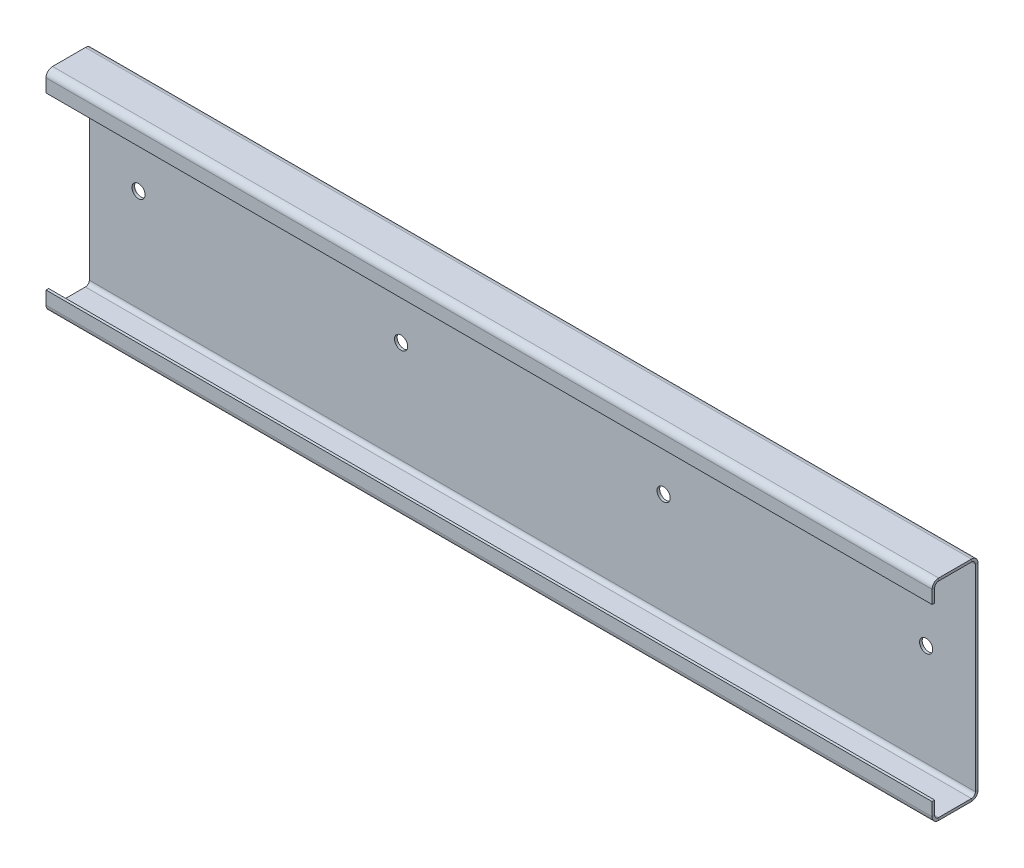
ISO-10303-21;
HEADER;
FILE_DESCRIPTION(('STEP AP214'),'2;1');
FILE_NAME('part.step','',(''),(''),'','','');
FILE_SCHEMA(('AUTOMOTIVE_DESIGN { 1 0 10303 214 1 1 1 1 }'));
ENDSEC;
DATA;
#1=APPLICATION_CONTEXT('core data for automotive mechanical design processes');
#2=APPLICATION_PROTOCOL_DEFINITION('international standard','automotive_design',2000,#1);
#3=PRODUCT_CONTEXT('',#1,'mechanical');
#4=PRODUCT('Part','Part','',(#3));
#5=PRODUCT_RELATED_PRODUCT_CATEGORY('part','',(#4));
#6=PRODUCT_DEFINITION_FORMATION('','',#4);
#7=PRODUCT_DEFINITION_CONTEXT('part definition',#1,'design');
#8=PRODUCT_DEFINITION('design','',#6,#7);
#9=PRODUCT_DEFINITION_SHAPE('','',#8);
#10=(LENGTH_UNIT() NAMED_UNIT(*) SI_UNIT(.MILLI.,.METRE.));
#11=(NAMED_UNIT(*) PLANE_ANGLE_UNIT() SI_UNIT($,.RADIAN.));
#12=(NAMED_UNIT(*) SI_UNIT($,.STERADIAN.) SOLID_ANGLE_UNIT());
#13=UNCERTAINTY_MEASURE_WITH_UNIT(LENGTH_MEASURE(1.E-05),#10,'distance_accuracy_value','');
#14=(GEOMETRIC_REPRESENTATION_CONTEXT(3) GLOBAL_UNCERTAINTY_ASSIGNED_CONTEXT((#13)) GLOBAL_UNIT_ASSIGNED_CONTEXT((#10,
#11,#12)) REPRESENTATION_CONTEXT('',''));
#15=CARTESIAN_POINT('',(0.,0.,0.));
#16=DIRECTION('',(0.,0.,1.));
#17=DIRECTION('',(1.,0.,0.));
#18=AXIS2_PLACEMENT_3D('',#15,#16,#17);
#19=CARTESIAN_POINT('',(-300.,2.48999999999999,8.00000000000001));
#20=DIRECTION('',(0.,0.,-1.));
#21=DIRECTION('',(-1.,0.,0.));
#22=AXIS2_PLACEMENT_3D('',#19,#20,#21);
#23=CYLINDRICAL_SURFACE('',#22,4.99999999999999);
#24=CARTESIAN_POINT('',(-300.,2.48999999999999,-2.));
#25=DIRECTION('',(0.,0.,-1.));
#26=DIRECTION('',(-1.,0.,0.));
#27=AXIS2_PLACEMENT_3D('',#24,#25,#26);
#28=CIRCLE('',#27,4.99999999999999);
#29=CARTESIAN_POINT('',(-305.,2.48999999999999,-2.));
#30=VERTEX_POINT('',#29);
#31=EDGE_CURVE('E139',#30,#30,#28,.T.);
#32=ORIENTED_EDGE('',*,*,#31,.T.);
#33=EDGE_LOOP('',(#32));
#34=FACE_BOUND('',#33,.T.);
#35=CARTESIAN_POINT('',(-300.,2.48999999999999,0.));
#36=DIRECTION('',(0.,0.,-1.));
#37=DIRECTION('',(-1.,0.,0.));
#38=AXIS2_PLACEMENT_3D('',#35,#36,#37);
#39=CIRCLE('',#38,4.99999999999999);
#40=CARTESIAN_POINT('',(-305.,2.48999999999999,0.));
#41=VERTEX_POINT('',#40);
#42=EDGE_CURVE('E15',#41,#41,#39,.T.);
#43=ORIENTED_EDGE('',*,*,#42,.F.);
#44=EDGE_LOOP('',(#43));
#45=FACE_BOUND('',#44,.T.);
#46=ADVANCED_FACE('F132',(#34,#45),#23,.F.);
#47=CARTESIAN_POINT('',(-100.,2.48999999999999,8.00000000000001));
#48=DIRECTION('',(0.,0.,-1.));
#49=DIRECTION('',(-1.,0.,0.));
#50=AXIS2_PLACEMENT_3D('',#47,#48,#49);
#51=CYLINDRICAL_SURFACE('',#50,4.99999999999999);
#52=CARTESIAN_POINT('',(-100.,2.48999999999999,-2.));
#53=DIRECTION('',(0.,0.,-1.));
#54=DIRECTION('',(-1.,0.,0.));
#55=AXIS2_PLACEMENT_3D('',#52,#53,#54);
#56=CIRCLE('',#55,4.99999999999999);
#57=CARTESIAN_POINT('',(-105.,2.48999999999999,-2.));
#58=VERTEX_POINT('',#57);
#59=EDGE_CURVE('E479',#58,#58,#56,.T.);
#60=ORIENTED_EDGE('',*,*,#59,.T.);
#61=EDGE_LOOP('',(#60));
#62=FACE_BOUND('',#61,.T.);
#63=CARTESIAN_POINT('',(-100.,2.48999999999999,0.));
#64=DIRECTION('',(0.,0.,-1.));
#65=DIRECTION('',(-1.,0.,0.));
#66=AXIS2_PLACEMENT_3D('',#63,#64,#65);
#67=CIRCLE('',#66,4.99999999999999);
#68=CARTESIAN_POINT('',(-105.,2.48999999999999,0.));
#69=VERTEX_POINT('',#68);
#70=EDGE_CURVE('E489',#69,#69,#67,.T.);
#71=ORIENTED_EDGE('',*,*,#70,.F.);
#72=EDGE_LOOP('',(#71));
#73=FACE_BOUND('',#72,.T.);
#74=ADVANCED_FACE('F515',(#62,#73),#51,.F.);
#75=CARTESIAN_POINT('',(337.5,80.,0.));
#76=DIRECTION('',(-1.,0.,0.));
#77=DIRECTION('',(0.,0.,1.));
#78=AXIS2_PLACEMENT_3D('',#75,#76,#77);
#79=PLANE('',#78);
#80=DIRECTION('',(0.,1.,0.));
#81=VECTOR('',#80,1.);
#82=CARTESIAN_POINT('',(337.5,78.0000000000001,28.));
#83=LINE('',#82,#81);
#84=CARTESIAN_POINT('',(337.5,78.0000000000001,28.));
#85=VERTEX_POINT('',#84);
#86=CARTESIAN_POINT('',(337.5,80.0000000000001,28.));
#87=VERTEX_POINT('',#86);
#88=EDGE_CURVE('E331',#85,#87,#83,.T.);
#89=ORIENTED_EDGE('',*,*,#88,.F.);
#90=DIRECTION('',(0.,0.,1.));
#91=VECTOR('',#90,1.);
#92=CARTESIAN_POINT('',(337.5,78.,0.));
#93=LINE('',#92,#91);
#94=CARTESIAN_POINT('',(337.5,78.0000000000001,3.00000000000011));
#95=VERTEX_POINT('',#94);
#96=EDGE_CURVE('E437',#85,#95,#93,.F.);
#97=ORIENTED_EDGE('',*,*,#96,.T.);
#98=DIRECTION('',(0.,-1.,0.));
#99=VECTOR('',#98,1.);
#100=CARTESIAN_POINT('',(337.5,80.0000000000001,2.99999999999989));
#101=LINE('',#100,#99);
#102=CARTESIAN_POINT('',(337.5,80.0000000000001,2.99999999999989));
#103=VERTEX_POINT('',#102);
#104=EDGE_CURVE('E427',#95,#103,#101,.F.);
#105=ORIENTED_EDGE('',*,*,#104,.T.);
#106=DIRECTION('',(0.,0.,-1.));
#107=VECTOR('',#106,1.);
#108=CARTESIAN_POINT('',(337.5,80.,-2.22044604925031E-13));
#109=LINE('',#108,#107);
#110=EDGE_CURVE('E433',#87,#103,#109,.T.);
#111=ORIENTED_EDGE('',*,*,#110,.F.);
#112=EDGE_LOOP('',(#89,#97,#105,#111));
#113=FACE_BOUND('',#112,.T.);
#114=ADVANCED_FACE('F519',(#113),#79,.F.);
#115=CARTESIAN_POINT('',(-337.5,80.0000000000001,32.9999999999999));
#116=DIRECTION('',(1.,0.,0.));
#117=DIRECTION('',(0.,0.,-1.));
#118=AXIS2_PLACEMENT_3D('',#115,#116,#117);
#119=PLANE('',#118);
#120=DIRECTION('',(0.,1.,0.));
#121=VECTOR('',#120,1.);
#122=CARTESIAN_POINT('',(-337.5,78.0000000000001,28.));
#123=LINE('',#122,#121);
#124=CARTESIAN_POINT('',(-337.5,78.0000000000001,28.));
#125=VERTEX_POINT('',#124);
#126=CARTESIAN_POINT('',(-337.5,80.0000000000001,28.));
#127=VERTEX_POINT('',#126);
#128=EDGE_CURVE('E321',#125,#127,#123,.T.);
#129=ORIENTED_EDGE('',*,*,#128,.T.);
#130=DIRECTION('',(0.,0.,1.));
#131=VECTOR('',#130,1.);
#132=CARTESIAN_POINT('',(-337.5,80.,-2.22044604925031E-13));
#133=LINE('',#132,#131);
#134=CARTESIAN_POINT('',(-337.5,80.0000000000001,2.99999999999989));
#135=VERTEX_POINT('',#134);
#136=EDGE_CURVE('E430',#135,#127,#133,.T.);
#137=ORIENTED_EDGE('',*,*,#136,.F.);
#138=DIRECTION('',(0.,-1.,0.));
#139=VECTOR('',#138,1.);
#140=CARTESIAN_POINT('',(-337.5,78.0000000000001,2.99999999999989));
#141=LINE('',#140,#139);
#142=CARTESIAN_POINT('',(-337.5,78.0000000000001,2.99999999999989));
#143=VERTEX_POINT('',#142);
#144=EDGE_CURVE('E442',#143,#135,#141,.F.);
#145=ORIENTED_EDGE('',*,*,#144,.F.);
#146=DIRECTION('',(0.,0.,-1.));
#147=VECTOR('',#146,1.);
#148=CARTESIAN_POINT('',(-337.5,78.0000000000001,32.9999999999999));
#149=LINE('',#148,#147);
#150=EDGE_CURVE('E435',#143,#125,#149,.F.);
#151=ORIENTED_EDGE('',*,*,#150,.T.);
#152=EDGE_LOOP('',(#129,#137,#145,#151));
#153=FACE_BOUND('',#152,.T.);
#154=ADVANCED_FACE('F524',(#153),#119,.F.);
#155=CARTESIAN_POINT('',(0.,80.,-2.22044604925031E-13));
#156=DIRECTION('',(0.,-1.,0.));
#157=DIRECTION('',(0.,0.,-1.));
#158=AXIS2_PLACEMENT_3D('',#155,#156,#157);
#159=PLANE('',#158);
#160=DIRECTION('',(-1.,0.,0.));
#161=VECTOR('',#160,1.);
#162=CARTESIAN_POINT('',(-337.5,80.0000000000001,28.));
#163=LINE('',#162,#161);
#164=EDGE_CURVE('E315',#127,#87,#163,.F.);
#165=ORIENTED_EDGE('',*,*,#164,.T.);
#166=ORIENTED_EDGE('',*,*,#110,.T.);
#167=DIRECTION('',(-1.,0.,0.));
#168=VECTOR('',#167,1.);
#169=CARTESIAN_POINT('',(337.5,80.0000000000001,2.99999999999989));
#170=LINE('',#169,#168);
#171=EDGE_CURVE('E439',#135,#103,#170,.F.);
#172=ORIENTED_EDGE('',*,*,#171,.F.);
#173=ORIENTED_EDGE('',*,*,#136,.T.);
#174=EDGE_LOOP('',(#165,#166,#172,#173));
#175=FACE_BOUND('',#174,.T.);
#176=ADVANCED_FACE('F684',(#175),#159,.F.);
#177=CARTESIAN_POINT('',(0.,78.,-2.22044604925031E-13));
#178=DIRECTION('',(0.,-1.,0.));
#179=DIRECTION('',(0.,0.,-1.));
#180=AXIS2_PLACEMENT_3D('',#177,#178,#179);
#181=PLANE('',#180);
#182=ORIENTED_EDGE('',*,*,#96,.F.);
#183=DIRECTION('',(-1.,0.,0.));
#184=VECTOR('',#183,1.);
#185=CARTESIAN_POINT('',(-337.5,78.0000000000001,28.));
#186=LINE('',#185,#184);
#187=EDGE_CURVE('E146',#125,#85,#186,.F.);
#188=ORIENTED_EDGE('',*,*,#187,.F.);
#189=ORIENTED_EDGE('',*,*,#150,.F.);
#190=DIRECTION('',(-1.,0.,0.));
#191=VECTOR('',#190,1.);
#192=CARTESIAN_POINT('',(337.5,78.0000000000001,2.99999999999989));
#193=LINE('',#192,#191);
#194=EDGE_CURVE('E445',#95,#143,#193,.T.);
#195=ORIENTED_EDGE('',*,*,#194,.F.);
#196=EDGE_LOOP('',(#182,#188,#189,#195));
#197=FACE_BOUND('',#196,.T.);
#198=ADVANCED_FACE('F560',(#197),#181,.T.);
#199=CARTESIAN_POINT('',(-337.5,-80.,0.));
#200=DIRECTION('',(1.,0.,0.));
#201=DIRECTION('',(0.,0.,-1.));
#202=AXIS2_PLACEMENT_3D('',#199,#200,#201);
#203=PLANE('',#202);
#204=DIRECTION('',(0.,-1.,0.));
#205=VECTOR('',#204,1.);
#206=CARTESIAN_POINT('',(-337.5,-78.0000000000001,28.));
#207=LINE('',#206,#205);
#208=CARTESIAN_POINT('',(-337.5,-78.0000000000001,28.));
#209=VERTEX_POINT('',#208);
#210=CARTESIAN_POINT('',(-337.5,-80.0000000000001,28.));
#211=VERTEX_POINT('',#210);
#212=EDGE_CURVE('E382',#209,#211,#207,.T.);
#213=ORIENTED_EDGE('',*,*,#212,.F.);
#214=DIRECTION('',(0.,0.,1.));
#215=VECTOR('',#214,1.);
#216=CARTESIAN_POINT('',(-337.5,-78.,0.));
#217=LINE('',#216,#215);
#218=CARTESIAN_POINT('',(-337.5,-78.,2.99999999999989));
#219=VERTEX_POINT('',#218);
#220=EDGE_CURVE('E395',#209,#219,#217,.F.);
#221=ORIENTED_EDGE('',*,*,#220,.T.);
#222=DIRECTION('',(0.,1.,0.));
#223=VECTOR('',#222,1.);
#224=CARTESIAN_POINT('',(-337.5,-80.,2.99999999999989));
#225=LINE('',#224,#223);
#226=CARTESIAN_POINT('',(-337.5,-80.,2.99999999999989));
#227=VERTEX_POINT('',#226);
#228=EDGE_CURVE('E385',#219,#227,#225,.F.);
#229=ORIENTED_EDGE('',*,*,#228,.T.);
#230=DIRECTION('',(0.,0.,-1.));
#231=VECTOR('',#230,1.);
#232=CARTESIAN_POINT('',(-337.5,-80.,-2.22044604925031E-13));
#233=LINE('',#232,#231);
#234=EDGE_CURVE('E391',#211,#227,#233,.T.);
#235=ORIENTED_EDGE('',*,*,#234,.F.);
#236=EDGE_LOOP('',(#213,#221,#229,#235));
#237=FACE_BOUND('',#236,.T.);
#238=ADVANCED_FACE('F665',(#237),#203,.F.);
#239=CARTESIAN_POINT('',(337.5,-80.0000000000001,32.9999999999999));
#240=DIRECTION('',(-1.,0.,0.));
#241=DIRECTION('',(0.,0.,1.));
#242=AXIS2_PLACEMENT_3D('',#239,#240,#241);
#243=PLANE('',#242);
#244=DIRECTION('',(0.,-1.,0.));
#245=VECTOR('',#244,1.);
#246=CARTESIAN_POINT('',(337.5,-78.0000000000001,28.));
#247=LINE('',#246,#245);
#248=CARTESIAN_POINT('',(337.5,-78.0000000000001,28.));
#249=VERTEX_POINT('',#248);
#250=CARTESIAN_POINT('',(337.5,-80.0000000000001,28.));
#251=VERTEX_POINT('',#250);
#252=EDGE_CURVE('E373',#249,#251,#247,.T.);
#253=ORIENTED_EDGE('',*,*,#252,.T.);
#254=DIRECTION('',(0.,0.,1.));
#255=VECTOR('',#254,1.);
#256=CARTESIAN_POINT('',(337.5,-80.,-2.22044604925031E-13));
#257=LINE('',#256,#255);
#258=CARTESIAN_POINT('',(337.5,-80.,2.99999999999989));
#259=VERTEX_POINT('',#258);
#260=EDGE_CURVE('E388',#259,#251,#257,.T.);
#261=ORIENTED_EDGE('',*,*,#260,.F.);
#262=DIRECTION('',(0.,1.,0.));
#263=VECTOR('',#262,1.);
#264=CARTESIAN_POINT('',(337.5,-78.,2.99999999999989));
#265=LINE('',#264,#263);
#266=CARTESIAN_POINT('',(337.5,-78.,3.00000000000011));
#267=VERTEX_POINT('',#266);
#268=EDGE_CURVE('E400',#267,#259,#265,.F.);
#269=ORIENTED_EDGE('',*,*,#268,.F.);
#270=DIRECTION('',(0.,0.,-1.));
#271=VECTOR('',#270,1.);
#272=CARTESIAN_POINT('',(337.5,-78.0000000000001,32.9999999999999));
#273=LINE('',#272,#271);
#274=EDGE_CURVE('E393',#267,#249,#273,.F.);
#275=ORIENTED_EDGE('',*,*,#274,.T.);
#276=EDGE_LOOP('',(#253,#261,#269,#275));
#277=FACE_BOUND('',#276,.T.);
#278=ADVANCED_FACE('F660',(#277),#243,.F.);
#279=CARTESIAN_POINT('',(0.,-80.,-2.22044604925031E-13));
#280=DIRECTION('',(0.,1.,0.));
#281=DIRECTION('',(0.,0.,1.));
#282=AXIS2_PLACEMENT_3D('',#279,#280,#281);
#283=PLANE('',#282);
#284=DIRECTION('',(1.,0.,0.));
#285=VECTOR('',#284,1.);
#286=CARTESIAN_POINT('',(337.5,-80.0000000000001,28.));
#287=LINE('',#286,#285);
#288=EDGE_CURVE('E367',#251,#211,#287,.F.);
#289=ORIENTED_EDGE('',*,*,#288,.T.);
#290=ORIENTED_EDGE('',*,*,#234,.T.);
#291=DIRECTION('',(1.,0.,0.));
#292=VECTOR('',#291,1.);
#293=CARTESIAN_POINT('',(-337.5,-80.,2.99999999999989));
#294=LINE('',#293,#292);
#295=EDGE_CURVE('E397',#259,#227,#294,.F.);
#296=ORIENTED_EDGE('',*,*,#295,.F.);
#297=ORIENTED_EDGE('',*,*,#260,.T.);
#298=EDGE_LOOP('',(#289,#290,#296,#297));
#299=FACE_BOUND('',#298,.T.);
#300=ADVANCED_FACE('F509',(#299),#283,.F.);
#301=CARTESIAN_POINT('',(0.,-78.,-2.22044604925031E-13));
#302=DIRECTION('',(0.,1.,0.));
#303=DIRECTION('',(0.,0.,1.));
#304=AXIS2_PLACEMENT_3D('',#301,#302,#303);
#305=PLANE('',#304);
#306=ORIENTED_EDGE('',*,*,#220,.F.);
#307=DIRECTION('',(1.,0.,0.));
#308=VECTOR('',#307,1.);
#309=CARTESIAN_POINT('',(337.5,-78.0000000000001,28.));
#310=LINE('',#309,#308);
#311=EDGE_CURVE('E154',#249,#209,#310,.F.);
#312=ORIENTED_EDGE('',*,*,#311,.F.);
#313=ORIENTED_EDGE('',*,*,#274,.F.);
#314=DIRECTION('',(1.,0.,0.));
#315=VECTOR('',#314,1.);
#316=CARTESIAN_POINT('',(-337.5,-78.,2.99999999999989));
#317=LINE('',#316,#315);
#318=EDGE_CURVE('E403',#219,#267,#317,.T.);
#319=ORIENTED_EDGE('',*,*,#318,.F.);
#320=EDGE_LOOP('',(#306,#312,#313,#319));
#321=FACE_BOUND('',#320,.T.);
#322=ADVANCED_FACE('F499',(#321),#305,.T.);
#323=CARTESIAN_POINT('',(0.,0.,-2.));
#324=DIRECTION('',(0.,0.,-1.));
#325=DIRECTION('',(-1.,0.,0.));
#326=AXIS2_PLACEMENT_3D('',#323,#324,#325);
#327=PLANE('',#326);
#328=CARTESIAN_POINT('',(99.9999999999998,2.48999999999999,-2.));
#329=DIRECTION('',(0.,0.,-1.));
#330=DIRECTION('',(-1.,0.,0.));
#331=AXIS2_PLACEMENT_3D('',#328,#329,#330);
#332=CIRCLE('',#331,4.99999999999999);
#333=CARTESIAN_POINT('',(94.9999999999998,2.48999999999999,-2.));
#334=VERTEX_POINT('',#333);
#335=EDGE_CURVE('E582',#334,#334,#332,.T.);
#336=ORIENTED_EDGE('',*,*,#335,.F.);
#337=EDGE_LOOP('',(#336));
#338=FACE_BOUND('',#337,.T.);
#339=CARTESIAN_POINT('',(300.,2.48999999999999,-2.));
#340=DIRECTION('',(0.,0.,-1.));
#341=DIRECTION('',(-1.,0.,0.));
#342=AXIS2_PLACEMENT_3D('',#339,#340,#341);
#343=CIRCLE('',#342,4.99999999999999);
#344=CARTESIAN_POINT('',(295.,2.48999999999999,-2.));
#345=VERTEX_POINT('',#344);
#346=EDGE_CURVE('E486',#345,#345,#343,.T.);
#347=ORIENTED_EDGE('',*,*,#346,.F.);
#348=EDGE_LOOP('',(#347));
#349=FACE_BOUND('',#348,.T.);
#350=DIRECTION('',(0.,1.,0.));
#351=VECTOR('',#350,1.);
#352=CARTESIAN_POINT('',(337.5,-80.,-2.));
#353=LINE('',#352,#351);
#354=CARTESIAN_POINT('',(337.5,-75.,-2.));
#355=VERTEX_POINT('',#354);
#356=CARTESIAN_POINT('',(337.5,75.0000000000001,-2.));
#357=VERTEX_POINT('',#356);
#358=EDGE_CURVE('E472',#355,#357,#353,.T.);
#359=ORIENTED_EDGE('',*,*,#358,.F.);
#360=DIRECTION('',(1.,0.,0.));
#361=VECTOR('',#360,1.);
#362=CARTESIAN_POINT('',(337.5,-75.,-2.));
#363=LINE('',#362,#361);
#364=CARTESIAN_POINT('',(-337.5,-75.,-2.));
#365=VERTEX_POINT('',#364);
#366=EDGE_CURVE('E407',#355,#365,#363,.F.);
#367=ORIENTED_EDGE('',*,*,#366,.T.);
#368=DIRECTION('',(0.,-1.,0.));
#369=VECTOR('',#368,1.);
#370=CARTESIAN_POINT('',(-337.5,-80.,-2.));
#371=LINE('',#370,#369);
#372=CARTESIAN_POINT('',(-337.5,75.,-2.));
#373=VERTEX_POINT('',#372);
#374=EDGE_CURVE('E475',#373,#365,#371,.T.);
#375=ORIENTED_EDGE('',*,*,#374,.F.);
#376=DIRECTION('',(-1.,0.,0.));
#377=VECTOR('',#376,1.);
#378=CARTESIAN_POINT('',(-337.5,75.,-2.));
#379=LINE('',#378,#377);
#380=EDGE_CURVE('E449',#373,#357,#379,.F.);
#381=ORIENTED_EDGE('',*,*,#380,.T.);
#382=EDGE_LOOP('',(#359,#367,#375,#381));
#383=FACE_BOUND('',#382,.T.);
#384=ORIENTED_EDGE('',*,*,#59,.F.);
#385=EDGE_LOOP('',(#384));
#386=FACE_BOUND('',#385,.T.);
#387=ORIENTED_EDGE('',*,*,#31,.F.);
#388=EDGE_LOOP('',(#387));
#389=FACE_BOUND('',#388,.T.);
#390=ADVANCED_FACE('F496',(#338,#349,#383,#386,#389),#327,.T.);
#391=CARTESIAN_POINT('',(0.,0.,0.));
#392=DIRECTION('',(0.,0.,-1.));
#393=DIRECTION('',(-1.,0.,0.));
#394=AXIS2_PLACEMENT_3D('',#391,#392,#393);
#395=PLANE('',#394);
#396=CARTESIAN_POINT('',(99.9999999999998,2.48999999999999,0.));
#397=DIRECTION('',(0.,0.,-1.));
#398=DIRECTION('',(-1.,0.,0.));
#399=AXIS2_PLACEMENT_3D('',#396,#397,#398);
#400=CIRCLE('',#399,4.99999999999999);
#401=CARTESIAN_POINT('',(94.9999999999998,2.48999999999999,0.));
#402=VERTEX_POINT('',#401);
#403=EDGE_CURVE('E579',#402,#402,#400,.T.);
#404=ORIENTED_EDGE('',*,*,#403,.T.);
#405=EDGE_LOOP('',(#404));
#406=FACE_BOUND('',#405,.T.);
#407=CARTESIAN_POINT('',(300.,2.48999999999999,0.));
#408=DIRECTION('',(0.,0.,-1.));
#409=DIRECTION('',(-1.,0.,0.));
#410=AXIS2_PLACEMENT_3D('',#407,#408,#409);
#411=CIRCLE('',#410,4.99999999999999);
#412=CARTESIAN_POINT('',(295.,2.48999999999999,0.));
#413=VERTEX_POINT('',#412);
#414=EDGE_CURVE('E314',#413,#413,#411,.T.);
#415=ORIENTED_EDGE('',*,*,#414,.T.);
#416=EDGE_LOOP('',(#415));
#417=FACE_BOUND('',#416,.T.);
#418=DIRECTION('',(1.,0.,0.));
#419=VECTOR('',#418,1.);
#420=CARTESIAN_POINT('',(337.5,-75.,0.));
#421=LINE('',#420,#419);
#422=CARTESIAN_POINT('',(337.5,-75.,0.));
#423=VERTEX_POINT('',#422);
#424=CARTESIAN_POINT('',(-337.5,-75.,0.));
#425=VERTEX_POINT('',#424);
#426=EDGE_CURVE('E420',#423,#425,#421,.F.);
#427=ORIENTED_EDGE('',*,*,#426,.F.);
#428=DIRECTION('',(0.,1.,0.));
#429=VECTOR('',#428,1.);
#430=CARTESIAN_POINT('',(337.5,-80.,0.));
#431=LINE('',#430,#429);
#432=CARTESIAN_POINT('',(337.5,75.,0.));
#433=VERTEX_POINT('',#432);
#434=EDGE_CURVE('E469',#423,#433,#431,.T.);
#435=ORIENTED_EDGE('',*,*,#434,.T.);
#436=DIRECTION('',(-1.,0.,0.));
#437=VECTOR('',#436,1.);
#438=CARTESIAN_POINT('',(-337.5,75.,0.));
#439=LINE('',#438,#437);
#440=CARTESIAN_POINT('',(-337.5,75.,0.));
#441=VERTEX_POINT('',#440);
#442=EDGE_CURVE('E462',#441,#433,#439,.F.);
#443=ORIENTED_EDGE('',*,*,#442,.F.);
#444=DIRECTION('',(0.,-1.,0.));
#445=VECTOR('',#444,1.);
#446=CARTESIAN_POINT('',(-337.5,-80.,0.));
#447=LINE('',#446,#445);
#448=EDGE_CURVE('E476',#441,#425,#447,.T.);
#449=ORIENTED_EDGE('',*,*,#448,.T.);
#450=EDGE_LOOP('',(#427,#435,#443,#449));
#451=FACE_BOUND('',#450,.T.);
#452=ORIENTED_EDGE('',*,*,#70,.T.);
#453=EDGE_LOOP('',(#452));
#454=FACE_BOUND('',#453,.T.);
#455=ORIENTED_EDGE('',*,*,#42,.T.);
#456=EDGE_LOOP('',(#455));
#457=FACE_BOUND('',#456,.T.);
#458=ADVANCED_FACE('F498',(#406,#417,#451,#454,#457),#395,.F.);
#459=CARTESIAN_POINT('',(337.5,-80.,-2.));
#460=DIRECTION('',(1.,0.,0.));
#461=DIRECTION('',(0.,0.,-1.));
#462=AXIS2_PLACEMENT_3D('',#459,#460,#461);
#463=PLANE('',#462);
#464=ORIENTED_EDGE('',*,*,#434,.F.);
#465=DIRECTION('',(0.,0.,-1.));
#466=VECTOR('',#465,1.);
#467=CARTESIAN_POINT('',(337.5,-75.,0.));
#468=LINE('',#467,#466);
#469=EDGE_CURVE('E414',#423,#355,#468,.T.);
#470=ORIENTED_EDGE('',*,*,#469,.T.);
#471=ORIENTED_EDGE('',*,*,#358,.T.);
#472=DIRECTION('',(0.,0.,-1.));
#473=VECTOR('',#472,1.);
#474=CARTESIAN_POINT('',(337.5,75.,0.));
#475=LINE('',#474,#473);
#476=EDGE_CURVE('E466',#433,#357,#475,.T.);
#477=ORIENTED_EDGE('',*,*,#476,.F.);
#478=EDGE_LOOP('',(#464,#470,#471,#477));
#479=FACE_BOUND('',#478,.T.);
#480=ADVANCED_FACE('F506',(#479),#463,.T.);
#481=CARTESIAN_POINT('',(-337.5,-80.,-2.));
#482=DIRECTION('',(-1.,0.,0.));
#483=DIRECTION('',(0.,0.,1.));
#484=AXIS2_PLACEMENT_3D('',#481,#482,#483);
#485=PLANE('',#484);
#486=DIRECTION('',(0.,0.,-1.));
#487=VECTOR('',#486,1.);
#488=CARTESIAN_POINT('',(-337.5,-75.,0.));
#489=LINE('',#488,#487);
#490=EDGE_CURVE('E424',#425,#365,#489,.T.);
#491=ORIENTED_EDGE('',*,*,#490,.F.);
#492=ORIENTED_EDGE('',*,*,#448,.F.);
#493=DIRECTION('',(0.,0.,-1.));
#494=VECTOR('',#493,1.);
#495=CARTESIAN_POINT('',(-337.5,75.,0.));
#496=LINE('',#495,#494);
#497=EDGE_CURVE('E456',#441,#373,#496,.T.);
#498=ORIENTED_EDGE('',*,*,#497,.T.);
#499=ORIENTED_EDGE('',*,*,#374,.T.);
#500=EDGE_LOOP('',(#491,#492,#498,#499));
#501=FACE_BOUND('',#500,.T.);
#502=ADVANCED_FACE('F531',(#501),#485,.T.);
#503=CARTESIAN_POINT('',(337.5,75.,3.00000000000011));
#504=DIRECTION('',(1.,0.,0.));
#505=DIRECTION('',(0.,0.,-1.));
#506=AXIS2_PLACEMENT_3D('',#503,#504,#505);
#507=PLANE('',#506);
#508=ORIENTED_EDGE('',*,*,#104,.F.);
#509=CARTESIAN_POINT('',(337.5,75.,3.00000000000011));
#510=DIRECTION('',(-1.,0.,0.));
#511=DIRECTION('',(0.,0.,1.));
#512=AXIS2_PLACEMENT_3D('',#509,#510,#511);
#513=CIRCLE('',#512,3.);
#514=EDGE_CURVE('E459',#433,#95,#513,.F.);
#515=ORIENTED_EDGE('',*,*,#514,.F.);
#516=ORIENTED_EDGE('',*,*,#476,.T.);
#517=CARTESIAN_POINT('',(337.5,75.,3.00000000000011));
#518=DIRECTION('',(-1.,0.,0.));
#519=DIRECTION('',(0.,0.,1.));
#520=AXIS2_PLACEMENT_3D('',#517,#518,#519);
#521=CIRCLE('',#520,5.);
#522=EDGE_CURVE('E452',#357,#103,#521,.F.);
#523=ORIENTED_EDGE('',*,*,#522,.T.);
#524=EDGE_LOOP('',(#508,#515,#516,#523));
#525=FACE_BOUND('',#524,.T.);
#526=ADVANCED_FACE('F534',(#525),#507,.T.);
#527=CARTESIAN_POINT('',(-337.5,75.,2.99999999999989));
#528=DIRECTION('',(1.,0.,0.));
#529=DIRECTION('',(0.,0.,-1.));
#530=AXIS2_PLACEMENT_3D('',#527,#528,#529);
#531=PLANE('',#530);
#532=CARTESIAN_POINT('',(-337.5,75.,2.99999999999989));
#533=DIRECTION('',(-1.,0.,0.));
#534=DIRECTION('',(0.,0.,1.));
#535=AXIS2_PLACEMENT_3D('',#532,#533,#534);
#536=CIRCLE('',#535,3.);
#537=EDGE_CURVE('E432',#143,#441,#536,.T.);
#538=ORIENTED_EDGE('',*,*,#537,.F.);
#539=ORIENTED_EDGE('',*,*,#144,.T.);
#540=CARTESIAN_POINT('',(-337.5,75.,2.99999999999989));
#541=DIRECTION('',(-1.,0.,0.));
#542=DIRECTION('',(0.,0.,1.));
#543=AXIS2_PLACEMENT_3D('',#540,#541,#542);
#544=CIRCLE('',#543,5.);
#545=EDGE_CURVE('E453',#135,#373,#544,.T.);
#546=ORIENTED_EDGE('',*,*,#545,.T.);
#547=ORIENTED_EDGE('',*,*,#497,.F.);
#548=EDGE_LOOP('',(#538,#539,#546,#547));
#549=FACE_BOUND('',#548,.T.);
#550=ADVANCED_FACE('F539',(#549),#531,.F.);
#551=CARTESIAN_POINT('',(-337.5,75.,2.99999999999989));
#552=DIRECTION('',(-1.,0.,0.));
#553=DIRECTION('',(0.,1.,0.));
#554=AXIS2_PLACEMENT_3D('',#551,#552,#553);
#555=CYLINDRICAL_SURFACE('',#554,5.);
#556=ORIENTED_EDGE('',*,*,#380,.F.);
#557=ORIENTED_EDGE('',*,*,#545,.F.);
#558=ORIENTED_EDGE('',*,*,#171,.T.);
#559=ORIENTED_EDGE('',*,*,#522,.F.);
#560=EDGE_LOOP('',(#556,#557,#558,#559));
#561=FACE_BOUND('',#560,.T.);
#562=ADVANCED_FACE('F693',(#561),#555,.T.);
#563=CARTESIAN_POINT('',(-337.5,75.,2.99999999999989));
#564=DIRECTION('',(-1.,0.,0.));
#565=DIRECTION('',(0.,1.,0.));
#566=AXIS2_PLACEMENT_3D('',#563,#564,#565);
#567=CYLINDRICAL_SURFACE('',#566,3.);
#568=ORIENTED_EDGE('',*,*,#442,.T.);
#569=ORIENTED_EDGE('',*,*,#514,.T.);
#570=ORIENTED_EDGE('',*,*,#194,.T.);
#571=ORIENTED_EDGE('',*,*,#537,.T.);
#572=EDGE_LOOP('',(#568,#569,#570,#571));
#573=FACE_BOUND('',#572,.T.);
#574=ADVANCED_FACE('F555',(#573),#567,.F.);
#575=CARTESIAN_POINT('',(-337.5,-75.,2.99999999999989));
#576=DIRECTION('',(-1.,0.,0.));
#577=DIRECTION('',(0.,0.,1.));
#578=AXIS2_PLACEMENT_3D('',#575,#576,#577);
#579=PLANE('',#578);
#580=ORIENTED_EDGE('',*,*,#228,.F.);
#581=CARTESIAN_POINT('',(-337.5,-75.,2.99999999999989));
#582=DIRECTION('',(1.,0.,0.));
#583=DIRECTION('',(0.,0.,-1.));
#584=AXIS2_PLACEMENT_3D('',#581,#582,#583);
#585=CIRCLE('',#584,3.);
#586=EDGE_CURVE('E417',#425,#219,#585,.F.);
#587=ORIENTED_EDGE('',*,*,#586,.F.);
#588=ORIENTED_EDGE('',*,*,#490,.T.);
#589=CARTESIAN_POINT('',(-337.5,-75.,2.99999999999989));
#590=DIRECTION('',(1.,0.,0.));
#591=DIRECTION('',(0.,0.,-1.));
#592=AXIS2_PLACEMENT_3D('',#589,#590,#591);
#593=CIRCLE('',#592,5.);
#594=EDGE_CURVE('E410',#365,#227,#593,.F.);
#595=ORIENTED_EDGE('',*,*,#594,.T.);
#596=EDGE_LOOP('',(#580,#587,#588,#595));
#597=FACE_BOUND('',#596,.T.);
#598=ADVANCED_FACE('F678',(#597),#579,.T.);
#599=CARTESIAN_POINT('',(337.5,-75.,3.00000000000011));
#600=DIRECTION('',(-1.,0.,0.));
#601=DIRECTION('',(0.,0.,1.));
#602=AXIS2_PLACEMENT_3D('',#599,#600,#601);
#603=PLANE('',#602);
#604=CARTESIAN_POINT('',(337.5,-75.,3.00000000000011));
#605=DIRECTION('',(1.,0.,0.));
#606=DIRECTION('',(0.,0.,-1.));
#607=AXIS2_PLACEMENT_3D('',#604,#605,#606);
#608=CIRCLE('',#607,3.);
#609=EDGE_CURVE('E390',#267,#423,#608,.T.);
#610=ORIENTED_EDGE('',*,*,#609,.F.);
#611=ORIENTED_EDGE('',*,*,#268,.T.);
#612=CARTESIAN_POINT('',(337.5,-75.,3.00000000000011));
#613=DIRECTION('',(1.,0.,0.));
#614=DIRECTION('',(0.,0.,-1.));
#615=AXIS2_PLACEMENT_3D('',#612,#613,#614);
#616=CIRCLE('',#615,5.);
#617=EDGE_CURVE('E411',#259,#355,#616,.T.);
#618=ORIENTED_EDGE('',*,*,#617,.T.);
#619=ORIENTED_EDGE('',*,*,#469,.F.);
#620=EDGE_LOOP('',(#610,#611,#618,#619));
#621=FACE_BOUND('',#620,.T.);
#622=ADVANCED_FACE('F673',(#621),#603,.F.);
#623=CARTESIAN_POINT('',(337.5,-75.,3.00000000000011));
#624=DIRECTION('',(1.,0.,0.));
#625=DIRECTION('',(0.,-1.,0.));
#626=AXIS2_PLACEMENT_3D('',#623,#624,#625);
#627=CYLINDRICAL_SURFACE('',#626,5.);
#628=ORIENTED_EDGE('',*,*,#366,.F.);
#629=ORIENTED_EDGE('',*,*,#617,.F.);
#630=ORIENTED_EDGE('',*,*,#295,.T.);
#631=ORIENTED_EDGE('',*,*,#594,.F.);
#632=EDGE_LOOP('',(#628,#629,#630,#631));
#633=FACE_BOUND('',#632,.T.);
#634=ADVANCED_FACE('F670',(#633),#627,.T.);
#635=CARTESIAN_POINT('',(337.5,-75.,3.00000000000011));
#636=DIRECTION('',(1.,0.,0.));
#637=DIRECTION('',(0.,-1.,0.));
#638=AXIS2_PLACEMENT_3D('',#635,#636,#637);
#639=CYLINDRICAL_SURFACE('',#638,3.);
#640=ORIENTED_EDGE('',*,*,#426,.T.);
#641=ORIENTED_EDGE('',*,*,#586,.T.);
#642=ORIENTED_EDGE('',*,*,#318,.T.);
#643=ORIENTED_EDGE('',*,*,#609,.T.);
#644=EDGE_LOOP('',(#640,#641,#642,#643));
#645=FACE_BOUND('',#644,.T.);
#646=ADVANCED_FACE('F654',(#645),#639,.F.);
#647=CARTESIAN_POINT('',(-337.5,-75.0000000000001,28.));
#648=DIRECTION('',(-1.,0.,0.));
#649=DIRECTION('',(0.,0.,1.));
#650=AXIS2_PLACEMENT_3D('',#647,#648,#649);
#651=PLANE('',#650);
#652=DIRECTION('',(0.,0.,-1.));
#653=VECTOR('',#652,1.);
#654=CARTESIAN_POINT('',(-337.5,-75.0000000000001,32.9999999999999));
#655=LINE('',#654,#653);
#656=CARTESIAN_POINT('',(-337.5,-75.0000000000001,30.9999999999999));
#657=VERTEX_POINT('',#656);
#658=CARTESIAN_POINT('',(-337.5,-75.0000000000001,32.9999999999999));
#659=VERTEX_POINT('',#658);
#660=EDGE_CURVE('E334',#657,#659,#655,.F.);
#661=ORIENTED_EDGE('',*,*,#660,.F.);
#662=CARTESIAN_POINT('',(-337.5,-75.0000000000001,28.));
#663=DIRECTION('',(1.,0.,0.));
#664=DIRECTION('',(0.,0.,-1.));
#665=AXIS2_PLACEMENT_3D('',#662,#663,#664);
#666=CIRCLE('',#665,3.);
#667=EDGE_CURVE('E376',#209,#657,#666,.F.);
#668=ORIENTED_EDGE('',*,*,#667,.F.);
#669=ORIENTED_EDGE('',*,*,#212,.T.);
#670=CARTESIAN_POINT('',(-337.5,-75.0000000000001,28.));
#671=DIRECTION('',(1.,0.,0.));
#672=DIRECTION('',(0.,0.,-1.));
#673=AXIS2_PLACEMENT_3D('',#670,#671,#672);
#674=CIRCLE('',#673,5.);
#675=EDGE_CURVE('E369',#211,#659,#674,.F.);
#676=ORIENTED_EDGE('',*,*,#675,.T.);
#677=EDGE_LOOP('',(#661,#668,#669,#676));
#678=FACE_BOUND('',#677,.T.);
#679=ADVANCED_FACE('F651',(#678),#651,.T.);
#680=CARTESIAN_POINT('',(337.5,-75.0000000000001,28.));
#681=DIRECTION('',(-1.,0.,0.));
#682=DIRECTION('',(0.,0.,1.));
#683=AXIS2_PLACEMENT_3D('',#680,#681,#682);
#684=PLANE('',#683);
#685=CARTESIAN_POINT('',(337.5,-75.0000000000001,28.));
#686=DIRECTION('',(1.,0.,0.));
#687=DIRECTION('',(0.,0.,-1.));
#688=AXIS2_PLACEMENT_3D('',#685,#686,#687);
#689=CIRCLE('',#688,3.);
#690=CARTESIAN_POINT('',(337.5,-75.0000000000001,30.9999999999999));
#691=VERTEX_POINT('',#690);
#692=EDGE_CURVE('E340',#691,#249,#689,.T.);
#693=ORIENTED_EDGE('',*,*,#692,.F.);
#694=DIRECTION('',(0.,0.,-1.));
#695=VECTOR('',#694,1.);
#696=CARTESIAN_POINT('',(337.5,-75.0000000000001,30.9999999999999));
#697=LINE('',#696,#695);
#698=CARTESIAN_POINT('',(337.5,-75.0000000000001,32.9999999999999));
#699=VERTEX_POINT('',#698);
#700=EDGE_CURVE('E360',#691,#699,#697,.F.);
#701=ORIENTED_EDGE('',*,*,#700,.T.);
#702=CARTESIAN_POINT('',(337.5,-75.0000000000001,28.));
#703=DIRECTION('',(1.,0.,0.));
#704=DIRECTION('',(0.,0.,-1.));
#705=AXIS2_PLACEMENT_3D('',#702,#703,#704);
#706=CIRCLE('',#705,5.);
#707=EDGE_CURVE('E370',#699,#251,#706,.T.);
#708=ORIENTED_EDGE('',*,*,#707,.T.);
#709=ORIENTED_EDGE('',*,*,#252,.F.);
#710=EDGE_LOOP('',(#693,#701,#708,#709));
#711=FACE_BOUND('',#710,.T.);
#712=ADVANCED_FACE('F646',(#711),#684,.F.);
#713=CARTESIAN_POINT('',(337.5,-75.0000000000001,28.));
#714=DIRECTION('',(1.,0.,0.));
#715=DIRECTION('',(0.,0.,1.));
#716=AXIS2_PLACEMENT_3D('',#713,#714,#715);
#717=CYLINDRICAL_SURFACE('',#716,5.);
#718=ORIENTED_EDGE('',*,*,#288,.F.);
#719=ORIENTED_EDGE('',*,*,#707,.F.);
#720=DIRECTION('',(1.,0.,0.));
#721=VECTOR('',#720,1.);
#722=CARTESIAN_POINT('',(-337.5,-75.0000000000001,32.9999999999999));
#723=LINE('',#722,#721);
#724=EDGE_CURVE('E358',#699,#659,#723,.F.);
#725=ORIENTED_EDGE('',*,*,#724,.T.);
#726=ORIENTED_EDGE('',*,*,#675,.F.);
#727=EDGE_LOOP('',(#718,#719,#725,#726));
#728=FACE_BOUND('',#727,.T.);
#729=ADVANCED_FACE('F643',(#728),#717,.T.);
#730=CARTESIAN_POINT('',(337.5,-75.0000000000001,28.));
#731=DIRECTION('',(1.,0.,0.));
#732=DIRECTION('',(0.,0.,1.));
#733=AXIS2_PLACEMENT_3D('',#730,#731,#732);
#734=CYLINDRICAL_SURFACE('',#733,3.);
#735=ORIENTED_EDGE('',*,*,#311,.T.);
#736=ORIENTED_EDGE('',*,*,#667,.T.);
#737=DIRECTION('',(1.,0.,0.));
#738=VECTOR('',#737,1.);
#739=CARTESIAN_POINT('',(-337.5,-75.0000000000001,30.9999999999999));
#740=LINE('',#739,#738);
#741=EDGE_CURVE('E363',#657,#691,#740,.T.);
#742=ORIENTED_EDGE('',*,*,#741,.T.);
#743=ORIENTED_EDGE('',*,*,#692,.T.);
#744=EDGE_LOOP('',(#735,#736,#742,#743));
#745=FACE_BOUND('',#744,.T.);
#746=ADVANCED_FACE('F641',(#745),#734,.F.);
#747=CARTESIAN_POINT('',(337.5,-65.0000000000001,32.9999999999999));
#748=DIRECTION('',(-1.,0.,0.));
#749=DIRECTION('',(0.,0.,1.));
#750=AXIS2_PLACEMENT_3D('',#747,#748,#749);
#751=PLANE('',#750);
#752=ORIENTED_EDGE('',*,*,#700,.F.);
#753=DIRECTION('',(0.,-1.,0.));
#754=VECTOR('',#753,1.);
#755=CARTESIAN_POINT('',(337.5,-65.0000000000001,30.9999999999999));
#756=LINE('',#755,#754);
#757=CARTESIAN_POINT('',(337.5,-65.0000000000001,30.9999999999999));
#758=VERTEX_POINT('',#757);
#759=EDGE_CURVE('E356',#691,#758,#756,.F.);
#760=ORIENTED_EDGE('',*,*,#759,.T.);
#761=DIRECTION('',(0.,0.,-1.));
#762=VECTOR('',#761,1.);
#763=CARTESIAN_POINT('',(337.5,-65.0000000000001,32.9999999999999));
#764=LINE('',#763,#762);
#765=CARTESIAN_POINT('',(337.5,-65.0000000000001,32.9999999999999));
#766=VERTEX_POINT('',#765);
#767=EDGE_CURVE('E337',#766,#758,#764,.T.);
#768=ORIENTED_EDGE('',*,*,#767,.F.);
#769=DIRECTION('',(0.,1.,0.));
#770=VECTOR('',#769,1.);
#771=CARTESIAN_POINT('',(337.5,0.,32.9999999999999));
#772=LINE('',#771,#770);
#773=EDGE_CURVE('E349',#699,#766,#772,.T.);
#774=ORIENTED_EDGE('',*,*,#773,.F.);
#775=EDGE_LOOP('',(#752,#760,#768,#774));
#776=FACE_BOUND('',#775,.T.);
#777=ADVANCED_FACE('F634',(#776),#751,.F.);
#778=CARTESIAN_POINT('',(-337.5,-78.0000000000001,32.9999999999999));
#779=DIRECTION('',(1.,0.,0.));
#780=DIRECTION('',(0.,0.,-1.));
#781=AXIS2_PLACEMENT_3D('',#778,#779,#780);
#782=PLANE('',#781);
#783=ORIENTED_EDGE('',*,*,#660,.T.);
#784=DIRECTION('',(0.,-1.,0.));
#785=VECTOR('',#784,1.);
#786=CARTESIAN_POINT('',(-337.5,0.,32.9999999999999));
#787=LINE('',#786,#785);
#788=CARTESIAN_POINT('',(-337.5,-65.0000000000001,32.9999999999999));
#789=VERTEX_POINT('',#788);
#790=EDGE_CURVE('E344',#789,#659,#787,.T.);
#791=ORIENTED_EDGE('',*,*,#790,.F.);
#792=DIRECTION('',(0.,0.,-1.));
#793=VECTOR('',#792,1.);
#794=CARTESIAN_POINT('',(-337.5,-65.0000000000001,32.9999999999999));
#795=LINE('',#794,#793);
#796=CARTESIAN_POINT('',(-337.5,-65.0000000000001,30.9999999999999));
#797=VERTEX_POINT('',#796);
#798=EDGE_CURVE('E341',#789,#797,#795,.T.);
#799=ORIENTED_EDGE('',*,*,#798,.T.);
#800=DIRECTION('',(0.,1.,0.));
#801=VECTOR('',#800,1.);
#802=CARTESIAN_POINT('',(-337.5,-78.0000000000001,30.9999999999999));
#803=LINE('',#802,#801);
#804=EDGE_CURVE('E351',#797,#657,#803,.F.);
#805=ORIENTED_EDGE('',*,*,#804,.T.);
#806=EDGE_LOOP('',(#783,#791,#799,#805));
#807=FACE_BOUND('',#806,.T.);
#808=ADVANCED_FACE('F627',(#807),#782,.F.);
#809=CARTESIAN_POINT('',(0.,0.,32.9999999999999));
#810=DIRECTION('',(0.,0.,-1.));
#811=DIRECTION('',(-1.,0.,0.));
#812=AXIS2_PLACEMENT_3D('',#809,#810,#811);
#813=PLANE('',#812);
#814=ORIENTED_EDGE('',*,*,#724,.F.);
#815=ORIENTED_EDGE('',*,*,#773,.T.);
#816=DIRECTION('',(-1.,0.,0.));
#817=VECTOR('',#816,1.);
#818=CARTESIAN_POINT('',(0.,-65.0000000000001,32.9999999999999));
#819=LINE('',#818,#817);
#820=EDGE_CURVE('E347',#766,#789,#819,.T.);
#821=ORIENTED_EDGE('',*,*,#820,.T.);
#822=ORIENTED_EDGE('',*,*,#790,.T.);
#823=EDGE_LOOP('',(#814,#815,#821,#822));
#824=FACE_BOUND('',#823,.T.);
#825=ADVANCED_FACE('F623',(#824),#813,.F.);
#826=CARTESIAN_POINT('',(0.,0.,30.9999999999999));
#827=DIRECTION('',(0.,0.,-1.));
#828=DIRECTION('',(-1.,0.,0.));
#829=AXIS2_PLACEMENT_3D('',#826,#827,#828);
#830=PLANE('',#829);
#831=ORIENTED_EDGE('',*,*,#759,.F.);
#832=ORIENTED_EDGE('',*,*,#741,.F.);
#833=ORIENTED_EDGE('',*,*,#804,.F.);
#834=DIRECTION('',(1.,0.,0.));
#835=VECTOR('',#834,1.);
#836=CARTESIAN_POINT('',(-337.5,-65.0000000000001,30.9999999999999));
#837=LINE('',#836,#835);
#838=EDGE_CURVE('E354',#758,#797,#837,.F.);
#839=ORIENTED_EDGE('',*,*,#838,.F.);
#840=EDGE_LOOP('',(#831,#832,#833,#839));
#841=FACE_BOUND('',#840,.T.);
#842=ADVANCED_FACE('F626',(#841),#830,.T.);
#843=CARTESIAN_POINT('',(-337.5,-65.0000000000001,32.9999999999999));
#844=DIRECTION('',(0.,-1.,0.));
#845=DIRECTION('',(0.,0.,-1.));
#846=AXIS2_PLACEMENT_3D('',#843,#844,#845);
#847=PLANE('',#846);
#848=ORIENTED_EDGE('',*,*,#838,.T.);
#849=ORIENTED_EDGE('',*,*,#798,.F.);
#850=ORIENTED_EDGE('',*,*,#820,.F.);
#851=ORIENTED_EDGE('',*,*,#767,.T.);
#852=EDGE_LOOP('',(#848,#849,#850,#851));
#853=FACE_BOUND('',#852,.T.);
#854=ADVANCED_FACE('F619',(#853),#847,.F.);
#855=CARTESIAN_POINT('',(337.5,75.0000000000002,28.));
#856=DIRECTION('',(1.,0.,0.));
#857=DIRECTION('',(0.,0.,-1.));
#858=AXIS2_PLACEMENT_3D('',#855,#856,#857);
#859=PLANE('',#858);
#860=DIRECTION('',(0.,0.,-1.));
#861=VECTOR('',#860,1.);
#862=CARTESIAN_POINT('',(337.5,75.0000000000002,32.9999999999999));
#863=LINE('',#862,#861);
#864=CARTESIAN_POINT('',(337.5,75.0000000000002,30.9999999999999));
#865=VERTEX_POINT('',#864);
#866=CARTESIAN_POINT('',(337.5,75.0000000000002,33.0000000000001));
#867=VERTEX_POINT('',#866);
#868=EDGE_CURVE('E296',#865,#867,#863,.F.);
#869=ORIENTED_EDGE('',*,*,#868,.F.);
#870=CARTESIAN_POINT('',(337.5,75.0000000000002,28.));
#871=DIRECTION('',(-1.,0.,0.));
#872=DIRECTION('',(0.,0.,1.));
#873=AXIS2_PLACEMENT_3D('',#870,#871,#872);
#874=CIRCLE('',#873,3.);
#875=EDGE_CURVE('E324',#85,#865,#874,.F.);
#876=ORIENTED_EDGE('',*,*,#875,.F.);
#877=ORIENTED_EDGE('',*,*,#88,.T.);
#878=CARTESIAN_POINT('',(337.5,75.0000000000002,28.));
#879=DIRECTION('',(-1.,0.,0.));
#880=DIRECTION('',(0.,0.,1.));
#881=AXIS2_PLACEMENT_3D('',#878,#879,#880);
#882=CIRCLE('',#881,5.);
#883=EDGE_CURVE('E317',#87,#867,#882,.F.);
#884=ORIENTED_EDGE('',*,*,#883,.T.);
#885=EDGE_LOOP('',(#869,#876,#877,#884));
#886=FACE_BOUND('',#885,.T.);
#887=ADVANCED_FACE('F567',(#886),#859,.T.);
#888=CARTESIAN_POINT('',(-337.5,75.0000000000002,28.));
#889=DIRECTION('',(1.,0.,0.));
#890=DIRECTION('',(0.,0.,-1.));
#891=AXIS2_PLACEMENT_3D('',#888,#889,#890);
#892=PLANE('',#891);
#893=CARTESIAN_POINT('',(-337.5,75.0000000000002,28.));
#894=DIRECTION('',(-1.,0.,0.));
#895=DIRECTION('',(0.,0.,1.));
#896=AXIS2_PLACEMENT_3D('',#893,#894,#895);
#897=CIRCLE('',#896,3.);
#898=CARTESIAN_POINT('',(-337.5,75.0000000000002,30.9999999999999));
#899=VERTEX_POINT('',#898);
#900=EDGE_CURVE('E328',#899,#125,#897,.T.);
#901=ORIENTED_EDGE('',*,*,#900,.F.);
#902=DIRECTION('',(0.,0.,-1.));
#903=VECTOR('',#902,1.);
#904=CARTESIAN_POINT('',(-337.5,75.0000000000002,30.9999999999999));
#905=LINE('',#904,#903);
#906=CARTESIAN_POINT('',(-337.5,75.0000000000002,33.0000000000001));
#907=VERTEX_POINT('',#906);
#908=EDGE_CURVE('E308',#899,#907,#905,.F.);
#909=ORIENTED_EDGE('',*,*,#908,.T.);
#910=CARTESIAN_POINT('',(-337.5,75.0000000000002,28.));
#911=DIRECTION('',(-1.,0.,0.));
#912=DIRECTION('',(0.,0.,1.));
#913=AXIS2_PLACEMENT_3D('',#910,#911,#912);
#914=CIRCLE('',#913,5.);
#915=EDGE_CURVE('E318',#907,#127,#914,.T.);
#916=ORIENTED_EDGE('',*,*,#915,.T.);
#917=ORIENTED_EDGE('',*,*,#128,.F.);
#918=EDGE_LOOP('',(#901,#909,#916,#917));
#919=FACE_BOUND('',#918,.T.);
#920=ADVANCED_FACE('F614',(#919),#892,.F.);
#921=CARTESIAN_POINT('',(-337.5,75.0000000000002,28.));
#922=DIRECTION('',(-1.,0.,0.));
#923=DIRECTION('',(0.,0.,1.));
#924=AXIS2_PLACEMENT_3D('',#921,#922,#923);
#925=CYLINDRICAL_SURFACE('',#924,5.);
#926=ORIENTED_EDGE('',*,*,#164,.F.);
#927=ORIENTED_EDGE('',*,*,#915,.F.);
#928=DIRECTION('',(-1.,0.,0.));
#929=VECTOR('',#928,1.);
#930=CARTESIAN_POINT('',(337.5,75.0000000000002,33.0000000000001));
#931=LINE('',#930,#929);
#932=EDGE_CURVE('E306',#907,#867,#931,.F.);
#933=ORIENTED_EDGE('',*,*,#932,.T.);
#934=ORIENTED_EDGE('',*,*,#883,.F.);
#935=EDGE_LOOP('',(#926,#927,#933,#934));
#936=FACE_BOUND('',#935,.T.);
#937=ADVANCED_FACE('F571',(#936),#925,.T.);
#938=CARTESIAN_POINT('',(-337.5,75.0000000000002,28.));
#939=DIRECTION('',(-1.,0.,0.));
#940=DIRECTION('',(0.,0.,1.));
#941=AXIS2_PLACEMENT_3D('',#938,#939,#940);
#942=CYLINDRICAL_SURFACE('',#941,3.);
#943=ORIENTED_EDGE('',*,*,#187,.T.);
#944=ORIENTED_EDGE('',*,*,#875,.T.);
#945=DIRECTION('',(-1.,0.,0.));
#946=VECTOR('',#945,1.);
#947=CARTESIAN_POINT('',(337.5,75.0000000000002,30.9999999999999));
#948=LINE('',#947,#946);
#949=EDGE_CURVE('E311',#865,#899,#948,.T.);
#950=ORIENTED_EDGE('',*,*,#949,.T.);
#951=ORIENTED_EDGE('',*,*,#900,.T.);
#952=EDGE_LOOP('',(#943,#944,#950,#951));
#953=FACE_BOUND('',#952,.T.);
#954=ADVANCED_FACE('F563',(#953),#942,.F.);
#955=CARTESIAN_POINT('',(-337.5,65.0000000000002,33.0000000000001));
#956=DIRECTION('',(1.,0.,0.));
#957=DIRECTION('',(0.,0.,-1.));
#958=AXIS2_PLACEMENT_3D('',#955,#956,#957);
#959=PLANE('',#958);
#960=ORIENTED_EDGE('',*,*,#908,.F.);
#961=DIRECTION('',(0.,1.,0.));
#962=VECTOR('',#961,1.);
#963=CARTESIAN_POINT('',(-337.5,65.0000000000001,31.0000000000001));
#964=LINE('',#963,#962);
#965=CARTESIAN_POINT('',(-337.5,65.0000000000001,31.0000000000001));
#966=VERTEX_POINT('',#965);
#967=EDGE_CURVE('E304',#899,#966,#964,.F.);
#968=ORIENTED_EDGE('',*,*,#967,.T.);
#969=DIRECTION('',(0.,0.,-1.));
#970=VECTOR('',#969,1.);
#971=CARTESIAN_POINT('',(-337.5,65.0000000000002,33.0000000000001));
#972=LINE('',#971,#970);
#973=CARTESIAN_POINT('',(-337.5,65.0000000000002,33.0000000000001));
#974=VERTEX_POINT('',#973);
#975=EDGE_CURVE('E292',#974,#966,#972,.T.);
#976=ORIENTED_EDGE('',*,*,#975,.F.);
#977=DIRECTION('',(0.,-1.,0.));
#978=VECTOR('',#977,1.);
#979=CARTESIAN_POINT('',(-337.5,2.22044604925031E-13,33.0000000000006));
#980=LINE('',#979,#978);
#981=EDGE_CURVE('E279',#907,#974,#980,.T.);
#982=ORIENTED_EDGE('',*,*,#981,.F.);
#983=EDGE_LOOP('',(#960,#968,#976,#982));
#984=FACE_BOUND('',#983,.T.);
#985=ADVANCED_FACE('F574',(#984),#959,.F.);
#986=CARTESIAN_POINT('',(337.5,78.0000000000001,32.9999999999999));
#987=DIRECTION('',(-1.,0.,0.));
#988=DIRECTION('',(0.,0.,1.));
#989=AXIS2_PLACEMENT_3D('',#986,#987,#988);
#990=PLANE('',#989);
#991=ORIENTED_EDGE('',*,*,#868,.T.);
#992=DIRECTION('',(0.,1.,0.));
#993=VECTOR('',#992,1.);
#994=CARTESIAN_POINT('',(337.5,2.22044604925031E-13,33.0000000000006));
#995=LINE('',#994,#993);
#996=CARTESIAN_POINT('',(337.5,65.0000000000002,33.0000000000001));
#997=VERTEX_POINT('',#996);
#998=EDGE_CURVE('E277',#997,#867,#995,.T.);
#999=ORIENTED_EDGE('',*,*,#998,.F.);
#1000=DIRECTION('',(0.,0.,-1.));
#1001=VECTOR('',#1000,1.);
#1002=CARTESIAN_POINT('',(337.5,65.0000000000002,33.0000000000001));
#1003=LINE('',#1002,#1001);
#1004=CARTESIAN_POINT('',(337.5,65.0000000000001,31.0000000000001));
#1005=VERTEX_POINT('',#1004);
#1006=EDGE_CURVE('E285',#997,#1005,#1003,.T.);
#1007=ORIENTED_EDGE('',*,*,#1006,.T.);
#1008=DIRECTION('',(0.,-1.,0.));
#1009=VECTOR('',#1008,1.);
#1010=CARTESIAN_POINT('',(337.5,78.0000000000001,30.9999999999999));
#1011=LINE('',#1010,#1009);
#1012=EDGE_CURVE('E301',#1005,#865,#1011,.F.);
#1013=ORIENTED_EDGE('',*,*,#1012,.T.);
#1014=EDGE_LOOP('',(#991,#999,#1007,#1013));
#1015=FACE_BOUND('',#1014,.T.);
#1016=ADVANCED_FACE('F295',(#1015),#990,.F.);
#1017=CARTESIAN_POINT('',(0.,2.22044604925031E-13,33.0000000000006));
#1018=DIRECTION('',(0.,0.,-1.));
#1019=DIRECTION('',(0.,1.,0.));
#1020=AXIS2_PLACEMENT_3D('',#1017,#1018,#1019);
#1021=PLANE('',#1020);
#1022=ORIENTED_EDGE('',*,*,#932,.F.);
#1023=ORIENTED_EDGE('',*,*,#981,.T.);
#1024=DIRECTION('',(1.,0.,0.));
#1025=VECTOR('',#1024,1.);
#1026=CARTESIAN_POINT('',(0.,65.0000000000002,33.0000000000001));
#1027=LINE('',#1026,#1025);
#1028=EDGE_CURVE('E272',#974,#997,#1027,.T.);
#1029=ORIENTED_EDGE('',*,*,#1028,.T.);
#1030=ORIENTED_EDGE('',*,*,#998,.T.);
#1031=EDGE_LOOP('',(#1022,#1023,#1029,#1030));
#1032=FACE_BOUND('',#1031,.T.);
#1033=ADVANCED_FACE('F275',(#1032),#1021,.F.);
#1034=CARTESIAN_POINT('',(0.,2.22044604925031E-13,31.0000000000006));
#1035=DIRECTION('',(0.,0.,-1.));
#1036=DIRECTION('',(0.,1.,0.));
#1037=AXIS2_PLACEMENT_3D('',#1034,#1035,#1036);
#1038=PLANE('',#1037);
#1039=ORIENTED_EDGE('',*,*,#967,.F.);
#1040=ORIENTED_EDGE('',*,*,#949,.F.);
#1041=ORIENTED_EDGE('',*,*,#1012,.F.);
#1042=DIRECTION('',(-1.,0.,0.));
#1043=VECTOR('',#1042,1.);
#1044=CARTESIAN_POINT('',(337.5,65.0000000000001,31.0000000000001));
#1045=LINE('',#1044,#1043);
#1046=EDGE_CURVE('E288',#966,#1005,#1045,.F.);
#1047=ORIENTED_EDGE('',*,*,#1046,.F.);
#1048=EDGE_LOOP('',(#1039,#1040,#1041,#1047));
#1049=FACE_BOUND('',#1048,.T.);
#1050=ADVANCED_FACE('F600',(#1049),#1038,.T.);
#1051=CARTESIAN_POINT('',(337.5,65.0000000000002,33.0000000000001));
#1052=DIRECTION('',(0.,1.,0.));
#1053=DIRECTION('',(0.,0.,1.));
#1054=AXIS2_PLACEMENT_3D('',#1051,#1052,#1053);
#1055=PLANE('',#1054);
#1056=ORIENTED_EDGE('',*,*,#1046,.T.);
#1057=ORIENTED_EDGE('',*,*,#1006,.F.);
#1058=ORIENTED_EDGE('',*,*,#1028,.F.);
#1059=ORIENTED_EDGE('',*,*,#975,.T.);
#1060=EDGE_LOOP('',(#1056,#1057,#1058,#1059));
#1061=FACE_BOUND('',#1060,.T.);
#1062=ADVANCED_FACE('F286',(#1061),#1055,.F.);
#1063=CARTESIAN_POINT('',(300.,2.48999999999999,8.00000000000001));
#1064=DIRECTION('',(0.,0.,-1.));
#1065=DIRECTION('',(-1.,0.,0.));
#1066=AXIS2_PLACEMENT_3D('',#1063,#1064,#1065);
#1067=CYLINDRICAL_SURFACE('',#1066,4.99999999999999);
#1068=ORIENTED_EDGE('',*,*,#346,.T.);
#1069=EDGE_LOOP('',(#1068));
#1070=FACE_BOUND('',#1069,.T.);
#1071=ORIENTED_EDGE('',*,*,#414,.F.);
#1072=EDGE_LOOP('',(#1071));
#1073=FACE_BOUND('',#1072,.T.);
#1074=ADVANCED_FACE('F588',(#1070,#1073),#1067,.F.);
#1075=CARTESIAN_POINT('',(99.9999999999998,2.48999999999999,8.00000000000001));
#1076=DIRECTION('',(0.,0.,-1.));
#1077=DIRECTION('',(-1.,0.,0.));
#1078=AXIS2_PLACEMENT_3D('',#1075,#1076,#1077);
#1079=CYLINDRICAL_SURFACE('',#1078,4.99999999999999);
#1080=ORIENTED_EDGE('',*,*,#335,.T.);
#1081=EDGE_LOOP('',(#1080));
#1082=FACE_BOUND('',#1081,.T.);
#1083=ORIENTED_EDGE('',*,*,#403,.F.);
#1084=EDGE_LOOP('',(#1083));
#1085=FACE_BOUND('',#1084,.T.);
#1086=ADVANCED_FACE('F585',(#1082,#1085),#1079,.F.);
#1087=CLOSED_SHELL('',(#46,#74,#114,#154,#176,#198,#238,#278,#300,#322,#390,#458,#480,#502,#526,
#550,#562,#574,#598,#622,#634,#646,#679,#712,#729,#746,#777,#808,#825,#842,#854,#887,#920,#937,
#954,#985,#1016,#1033,#1050,#1062,#1074,#1086));
#1088=MANIFOLD_SOLID_BREP('B2',#1087);
#1089=ADVANCED_BREP_SHAPE_REPRESENTATION('',(#18,#1088),#14);
#1090=SHAPE_DEFINITION_REPRESENTATION(#9,#1089);
ENDSEC;
END-ISO-10303-21;
